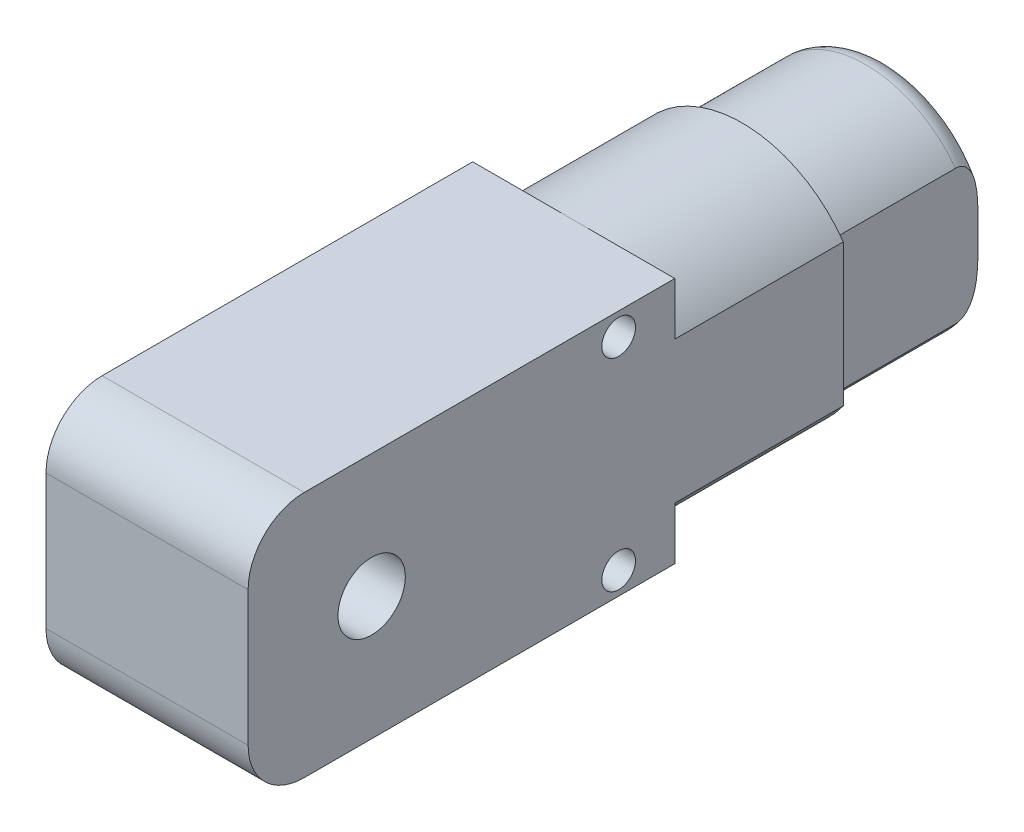
ISO-10303-21;
HEADER;
FILE_DESCRIPTION(('STEP AP214'),'2;1');
FILE_NAME('part.step','',(''),(''),'','','');
FILE_SCHEMA(('AUTOMOTIVE_DESIGN { 1 0 10303 214 1 1 1 1 }'));
ENDSEC;
DATA;
#1=APPLICATION_CONTEXT('core data for automotive mechanical design processes');
#2=APPLICATION_PROTOCOL_DEFINITION('international standard','automotive_design',2000,#1);
#3=PRODUCT_CONTEXT('',#1,'mechanical');
#4=PRODUCT('Part','Part','',(#3));
#5=PRODUCT_RELATED_PRODUCT_CATEGORY('part','',(#4));
#6=PRODUCT_DEFINITION_FORMATION('','',#4);
#7=PRODUCT_DEFINITION_CONTEXT('part definition',#1,'design');
#8=PRODUCT_DEFINITION('design','',#6,#7);
#9=PRODUCT_DEFINITION_SHAPE('','',#8);
#10=(LENGTH_UNIT() NAMED_UNIT(*) SI_UNIT(.MILLI.,.METRE.));
#11=(NAMED_UNIT(*) PLANE_ANGLE_UNIT() SI_UNIT($,.RADIAN.));
#12=(NAMED_UNIT(*) SI_UNIT($,.STERADIAN.) SOLID_ANGLE_UNIT());
#13=UNCERTAINTY_MEASURE_WITH_UNIT(LENGTH_MEASURE(1.E-05),#10,'distance_accuracy_value','');
#14=(GEOMETRIC_REPRESENTATION_CONTEXT(3) GLOBAL_UNCERTAINTY_ASSIGNED_CONTEXT((#13)) GLOBAL_UNIT_ASSIGNED_CONTEXT((#10,
#11,#12)) REPRESENTATION_CONTEXT('',''));
#15=CARTESIAN_POINT('',(0.,0.,0.));
#16=DIRECTION('',(0.,0.,1.));
#17=DIRECTION('',(1.,0.,0.));
#18=AXIS2_PLACEMENT_3D('',#15,#16,#17);
#19=CARTESIAN_POINT('',(18.,0.,0.));
#20=DIRECTION('',(1.,0.,0.));
#21=DIRECTION('',(0.,0.,-1.));
#22=AXIS2_PLACEMENT_3D('',#19,#20,#21);
#23=PLANE('',#22);
#24=CARTESIAN_POINT('',(18.,0.,8.));
#25=DIRECTION('',(1.,0.,0.));
#26=DIRECTION('',(0.,0.,-1.));
#27=AXIS2_PLACEMENT_3D('',#24,#25,#26);
#28=CIRCLE('',#27,3.);
#29=CARTESIAN_POINT('',(18.,0.,5.));
#30=VERTEX_POINT('',#29);
#31=EDGE_CURVE('E618',#30,#30,#28,.T.);
#32=ORIENTED_EDGE('',*,*,#31,.F.);
#33=EDGE_LOOP('',(#32));
#34=FACE_BOUND('',#33,.T.);
#35=DIRECTION('',(0.,0.,1.));
#36=VECTOR('',#35,1.);
#37=CARTESIAN_POINT('',(18.,11.,-19.));
#38=LINE('',#37,#36);
#39=CARTESIAN_POINT('',(18.,11.,-19.));
#40=VERTEX_POINT('',#39);
#41=CARTESIAN_POINT('',(18.,11.,14.));
#42=VERTEX_POINT('',#41);
#43=EDGE_CURVE('E247',#40,#42,#38,.T.);
#44=ORIENTED_EDGE('',*,*,#43,.T.);
#45=CARTESIAN_POINT('',(18.,6.,14.));
#46=DIRECTION('',(1.,0.,0.));
#47=DIRECTION('',(0.,0.,-1.));
#48=AXIS2_PLACEMENT_3D('',#45,#46,#47);
#49=CIRCLE('',#48,5.);
#50=CARTESIAN_POINT('',(18.,6.,19.));
#51=VERTEX_POINT('',#50);
#52=EDGE_CURVE('E294',#42,#51,#49,.T.);
#53=ORIENTED_EDGE('',*,*,#52,.T.);
#54=DIRECTION('',(0.,-1.,0.));
#55=VECTOR('',#54,1.);
#56=CARTESIAN_POINT('',(18.,-11.,19.));
#57=LINE('',#56,#55);
#58=CARTESIAN_POINT('',(18.,-6.,19.));
#59=VERTEX_POINT('',#58);
#60=EDGE_CURVE('E234',#51,#59,#57,.T.);
#61=ORIENTED_EDGE('',*,*,#60,.T.);
#62=CARTESIAN_POINT('',(18.,-6.,14.));
#63=DIRECTION('',(1.,0.,0.));
#64=DIRECTION('',(0.,0.,-1.));
#65=AXIS2_PLACEMENT_3D('',#62,#63,#64);
#66=CIRCLE('',#65,5.);
#67=CARTESIAN_POINT('',(18.,-11.,14.));
#68=VERTEX_POINT('',#67);
#69=EDGE_CURVE('E291',#59,#68,#66,.T.);
#70=ORIENTED_EDGE('',*,*,#69,.T.);
#71=DIRECTION('',(0.,0.,-1.));
#72=VECTOR('',#71,1.);
#73=CARTESIAN_POINT('',(18.,-11.,-19.));
#74=LINE('',#73,#72);
#75=CARTESIAN_POINT('',(18.,-11.,-19.));
#76=VERTEX_POINT('',#75);
#77=EDGE_CURVE('E238',#68,#76,#74,.T.);
#78=ORIENTED_EDGE('',*,*,#77,.T.);
#79=DIRECTION('',(0.,1.,0.));
#80=VECTOR('',#79,1.);
#81=CARTESIAN_POINT('',(18.,-11.,-19.));
#82=LINE('',#81,#80);
#83=CARTESIAN_POINT('',(18.,-6.32455532033677,-19.));
#84=VERTEX_POINT('',#83);
#85=EDGE_CURVE('E243',#76,#84,#82,.T.);
#86=ORIENTED_EDGE('',*,*,#85,.T.);
#87=DIRECTION('',(0.,0.,1.));
#88=VECTOR('',#87,1.);
#89=CARTESIAN_POINT('',(18.,-6.32455532033677,-34.));
#90=LINE('',#89,#88);
#91=CARTESIAN_POINT('',(18.,-6.32455532033677,-34.));
#92=VERTEX_POINT('',#91);
#93=EDGE_CURVE('E209',#92,#84,#90,.T.);
#94=ORIENTED_EDGE('',*,*,#93,.F.);
#95=DIRECTION('',(0.,-1.,0.));
#96=VECTOR('',#95,1.);
#97=CARTESIAN_POINT('',(18.,6.32455532033677,-34.));
#98=LINE('',#97,#96);
#99=CARTESIAN_POINT('',(18.,6.32455532033677,-34.));
#100=VERTEX_POINT('',#99);
#101=EDGE_CURVE('E206',#100,#92,#98,.T.);
#102=ORIENTED_EDGE('',*,*,#101,.F.);
#103=DIRECTION('',(0.,0.,1.));
#104=VECTOR('',#103,1.);
#105=CARTESIAN_POINT('',(18.,6.32455532033677,-34.));
#106=LINE('',#105,#104);
#107=CARTESIAN_POINT('',(18.,6.32455532033677,-19.));
#108=VERTEX_POINT('',#107);
#109=EDGE_CURVE('E221',#100,#108,#106,.T.);
#110=ORIENTED_EDGE('',*,*,#109,.T.);
#111=EDGE_CURVE('E242',#108,#40,#82,.T.);
#112=ORIENTED_EDGE('',*,*,#111,.T.);
#113=EDGE_LOOP('',(#44,#53,#61,#70,#78,#86,#94,#102,#110,#112));
#114=FACE_BOUND('',#113,.T.);
#115=CARTESIAN_POINT('',(18.,-9.,-14.));
#116=DIRECTION('',(1.,0.,0.));
#117=DIRECTION('',(0.,0.,-1.));
#118=AXIS2_PLACEMENT_3D('',#115,#116,#117);
#119=CIRCLE('',#118,1.5);
#120=CARTESIAN_POINT('',(18.,-9.,-15.5));
#121=VERTEX_POINT('',#120);
#122=EDGE_CURVE('E632',#121,#121,#119,.T.);
#123=ORIENTED_EDGE('',*,*,#122,.F.);
#124=EDGE_LOOP('',(#123));
#125=FACE_BOUND('',#124,.T.);
#126=CARTESIAN_POINT('',(18.,9.,-14.));
#127=DIRECTION('',(-1.,0.,0.));
#128=DIRECTION('',(0.,0.,1.));
#129=AXIS2_PLACEMENT_3D('',#126,#127,#128);
#130=CIRCLE('',#129,1.5);
#131=CARTESIAN_POINT('',(18.,9.,-12.5));
#132=VERTEX_POINT('',#131);
#133=EDGE_CURVE('E620',#132,#132,#130,.T.);
#134=ORIENTED_EDGE('',*,*,#133,.T.);
#135=EDGE_LOOP('',(#134));
#136=FACE_BOUND('',#135,.T.);
#137=ADVANCED_FACE('F41',(#34,#114,#125,#136),#23,.T.);
#138=CARTESIAN_POINT('',(0.,0.,0.));
#139=DIRECTION('',(1.,0.,0.));
#140=DIRECTION('',(0.,0.,-1.));
#141=AXIS2_PLACEMENT_3D('',#138,#139,#140);
#142=PLANE('',#141);
#143=CARTESIAN_POINT('',(0.,0.,8.));
#144=DIRECTION('',(1.,0.,0.));
#145=DIRECTION('',(0.,0.,-1.));
#146=AXIS2_PLACEMENT_3D('',#143,#144,#145);
#147=CIRCLE('',#146,3.);
#148=CARTESIAN_POINT('',(0.,0.,5.));
#149=VERTEX_POINT('',#148);
#150=EDGE_CURVE('E181',#149,#149,#147,.T.);
#151=ORIENTED_EDGE('',*,*,#150,.T.);
#152=EDGE_LOOP('',(#151));
#153=FACE_BOUND('',#152,.T.);
#154=CARTESIAN_POINT('',(0.,-9.,-14.));
#155=DIRECTION('',(1.,0.,0.));
#156=DIRECTION('',(0.,0.,-1.));
#157=AXIS2_PLACEMENT_3D('',#154,#155,#156);
#158=CIRCLE('',#157,1.5);
#159=CARTESIAN_POINT('',(0.,-9.,-15.5));
#160=VERTEX_POINT('',#159);
#161=EDGE_CURVE('E635',#160,#160,#158,.T.);
#162=ORIENTED_EDGE('',*,*,#161,.T.);
#163=EDGE_LOOP('',(#162));
#164=FACE_BOUND('',#163,.T.);
#165=DIRECTION('',(0.,-1.,0.));
#166=VECTOR('',#165,1.);
#167=CARTESIAN_POINT('',(0.,-11.,19.));
#168=LINE('',#167,#166);
#169=CARTESIAN_POINT('',(0.,6.,19.));
#170=VERTEX_POINT('',#169);
#171=CARTESIAN_POINT('',(0.,-6.,19.));
#172=VERTEX_POINT('',#171);
#173=EDGE_CURVE('E233',#170,#172,#168,.T.);
#174=ORIENTED_EDGE('',*,*,#173,.F.);
#175=CARTESIAN_POINT('',(0.,6.,14.));
#176=DIRECTION('',(1.,0.,0.));
#177=DIRECTION('',(0.,0.,-1.));
#178=AXIS2_PLACEMENT_3D('',#175,#176,#177);
#179=CIRCLE('',#178,5.);
#180=CARTESIAN_POINT('',(0.,11.,14.));
#181=VERTEX_POINT('',#180);
#182=EDGE_CURVE('E285',#170,#181,#179,.F.);
#183=ORIENTED_EDGE('',*,*,#182,.T.);
#184=DIRECTION('',(0.,0.,1.));
#185=VECTOR('',#184,1.);
#186=CARTESIAN_POINT('',(0.,11.,-19.));
#187=LINE('',#186,#185);
#188=CARTESIAN_POINT('',(0.,11.,-19.));
#189=VERTEX_POINT('',#188);
#190=EDGE_CURVE('E239',#189,#181,#187,.T.);
#191=ORIENTED_EDGE('',*,*,#190,.F.);
#192=DIRECTION('',(0.,1.,0.));
#193=VECTOR('',#192,1.);
#194=CARTESIAN_POINT('',(0.,-11.,-19.));
#195=LINE('',#194,#193);
#196=CARTESIAN_POINT('',(0.,6.32455532033677,-19.));
#197=VERTEX_POINT('',#196);
#198=EDGE_CURVE('E259',#197,#189,#195,.T.);
#199=ORIENTED_EDGE('',*,*,#198,.F.);
#200=DIRECTION('',(0.,0.,1.));
#201=VECTOR('',#200,1.);
#202=CARTESIAN_POINT('',(0.,6.32455532033677,-34.));
#203=LINE('',#202,#201);
#204=CARTESIAN_POINT('',(0.,6.32455532033677,-34.));
#205=VERTEX_POINT('',#204);
#206=EDGE_CURVE('E225',#205,#197,#203,.T.);
#207=ORIENTED_EDGE('',*,*,#206,.F.);
#208=DIRECTION('',(0.,1.,0.));
#209=VECTOR('',#208,1.);
#210=CARTESIAN_POINT('',(0.,-6.32455532033677,-34.));
#211=LINE('',#210,#209);
#212=CARTESIAN_POINT('',(0.,-6.32455532033677,-34.));
#213=VERTEX_POINT('',#212);
#214=EDGE_CURVE('E199',#213,#205,#211,.T.);
#215=ORIENTED_EDGE('',*,*,#214,.F.);
#216=DIRECTION('',(0.,0.,1.));
#217=VECTOR('',#216,1.);
#218=CARTESIAN_POINT('',(0.,-6.32455532033677,-34.));
#219=LINE('',#218,#217);
#220=CARTESIAN_POINT('',(0.,-6.32455532033677,-19.));
#221=VERTEX_POINT('',#220);
#222=EDGE_CURVE('E229',#213,#221,#219,.T.);
#223=ORIENTED_EDGE('',*,*,#222,.T.);
#224=CARTESIAN_POINT('',(0.,-11.,-19.));
#225=VERTEX_POINT('',#224);
#226=EDGE_CURVE('E260',#225,#221,#195,.T.);
#227=ORIENTED_EDGE('',*,*,#226,.F.);
#228=DIRECTION('',(0.,0.,-1.));
#229=VECTOR('',#228,1.);
#230=CARTESIAN_POINT('',(0.,-11.,-19.));
#231=LINE('',#230,#229);
#232=CARTESIAN_POINT('',(0.,-11.,14.));
#233=VERTEX_POINT('',#232);
#234=EDGE_CURVE('E255',#233,#225,#231,.T.);
#235=ORIENTED_EDGE('',*,*,#234,.F.);
#236=CARTESIAN_POINT('',(0.,-6.,14.));
#237=DIRECTION('',(1.,0.,0.));
#238=DIRECTION('',(0.,0.,-1.));
#239=AXIS2_PLACEMENT_3D('',#236,#237,#238);
#240=CIRCLE('',#239,5.);
#241=EDGE_CURVE('E282',#233,#172,#240,.F.);
#242=ORIENTED_EDGE('',*,*,#241,.T.);
#243=EDGE_LOOP('',(#174,#183,#191,#199,#207,#215,#223,#227,#235,#242));
#244=FACE_BOUND('',#243,.T.);
#245=CARTESIAN_POINT('',(0.,9.,-14.));
#246=DIRECTION('',(-1.,0.,0.));
#247=DIRECTION('',(0.,0.,1.));
#248=AXIS2_PLACEMENT_3D('',#245,#246,#247);
#249=CIRCLE('',#248,1.5);
#250=CARTESIAN_POINT('',(0.,9.,-12.5));
#251=VERTEX_POINT('',#250);
#252=EDGE_CURVE('E626',#251,#251,#249,.T.);
#253=ORIENTED_EDGE('',*,*,#252,.F.);
#254=EDGE_LOOP('',(#253));
#255=FACE_BOUND('',#254,.T.);
#256=ADVANCED_FACE('F384',(#153,#164,#244,#255),#142,.F.);
#257=CARTESIAN_POINT('',(18.,-11.,-19.));
#258=DIRECTION('',(0.,0.,1.));
#259=DIRECTION('',(1.,0.,0.));
#260=AXIS2_PLACEMENT_3D('',#257,#258,#259);
#261=PLANE('',#260);
#262=CARTESIAN_POINT('',(9.,0.,-19.));
#263=DIRECTION('',(0.,0.,-1.));
#264=DIRECTION('',(-1.,0.,0.));
#265=AXIS2_PLACEMENT_3D('',#262,#263,#264);
#266=CIRCLE('',#265,11.);
#267=CARTESIAN_POINT('',(9.,-11.,-19.));
#268=VERTEX_POINT('',#267);
#269=EDGE_CURVE('E194',#84,#268,#266,.T.);
#270=ORIENTED_EDGE('',*,*,#269,.F.);
#271=ORIENTED_EDGE('',*,*,#85,.F.);
#272=DIRECTION('',(-1.,0.,0.));
#273=VECTOR('',#272,1.);
#274=CARTESIAN_POINT('',(18.,-11.,-19.));
#275=LINE('',#274,#273);
#276=EDGE_CURVE('E271',#76,#268,#275,.T.);
#277=ORIENTED_EDGE('',*,*,#276,.T.);
#278=EDGE_LOOP('',(#270,#271,#277));
#279=FACE_BOUND('',#278,.T.);
#280=ADVANCED_FACE('F380',(#279),#261,.F.);
#281=EDGE_CURVE('E213',#268,#221,#266,.T.);
#282=ORIENTED_EDGE('',*,*,#281,.F.);
#283=EDGE_CURVE('E270',#268,#225,#275,.T.);
#284=ORIENTED_EDGE('',*,*,#283,.T.);
#285=ORIENTED_EDGE('',*,*,#226,.T.);
#286=EDGE_LOOP('',(#282,#284,#285));
#287=FACE_BOUND('',#286,.T.);
#288=ADVANCED_FACE('F456',(#287),#261,.F.);
#289=CARTESIAN_POINT('',(9.,0.,-19.));
#290=DIRECTION('',(0.,0.,-1.));
#291=DIRECTION('',(-1.,0.,0.));
#292=AXIS2_PLACEMENT_3D('',#289,#290,#291);
#293=CIRCLE('',#292,11.);
#294=CARTESIAN_POINT('',(9.,11.,-19.));
#295=VERTEX_POINT('',#294);
#296=EDGE_CURVE('E200',#197,#295,#293,.T.);
#297=ORIENTED_EDGE('',*,*,#296,.F.);
#298=ORIENTED_EDGE('',*,*,#198,.T.);
#299=DIRECTION('',(-1.,0.,0.));
#300=VECTOR('',#299,1.);
#301=CARTESIAN_POINT('',(18.,11.,-19.));
#302=LINE('',#301,#300);
#303=EDGE_CURVE('E251',#295,#189,#302,.T.);
#304=ORIENTED_EDGE('',*,*,#303,.F.);
#305=EDGE_LOOP('',(#297,#298,#304));
#306=FACE_BOUND('',#305,.T.);
#307=ADVANCED_FACE('F371',(#306),#261,.F.);
#308=CARTESIAN_POINT('',(18.,-11.,19.));
#309=DIRECTION('',(0.,0.,-1.));
#310=DIRECTION('',(-1.,0.,0.));
#311=AXIS2_PLACEMENT_3D('',#308,#309,#310);
#312=PLANE('',#311);
#313=ORIENTED_EDGE('',*,*,#60,.F.);
#314=DIRECTION('',(-1.,0.,0.));
#315=VECTOR('',#314,1.);
#316=CARTESIAN_POINT('',(18.,6.,19.));
#317=LINE('',#316,#315);
#318=EDGE_CURVE('E278',#51,#170,#317,.T.);
#319=ORIENTED_EDGE('',*,*,#318,.T.);
#320=ORIENTED_EDGE('',*,*,#173,.T.);
#321=DIRECTION('',(-1.,0.,0.));
#322=VECTOR('',#321,1.);
#323=CARTESIAN_POINT('',(18.,-6.,19.));
#324=LINE('',#323,#322);
#325=EDGE_CURVE('E275',#172,#59,#324,.F.);
#326=ORIENTED_EDGE('',*,*,#325,.T.);
#327=EDGE_LOOP('',(#313,#319,#320,#326));
#328=FACE_BOUND('',#327,.T.);
#329=ADVANCED_FACE('F367',(#328),#312,.F.);
#330=CARTESIAN_POINT('',(18.,-11.,-19.));
#331=DIRECTION('',(0.,1.,0.));
#332=DIRECTION('',(0.,0.,1.));
#333=AXIS2_PLACEMENT_3D('',#330,#331,#332);
#334=PLANE('',#333);
#335=ORIENTED_EDGE('',*,*,#77,.F.);
#336=DIRECTION('',(-1.,0.,0.));
#337=VECTOR('',#336,1.);
#338=CARTESIAN_POINT('',(18.,-11.,14.));
#339=LINE('',#338,#337);
#340=EDGE_CURVE('E297',#68,#233,#339,.T.);
#341=ORIENTED_EDGE('',*,*,#340,.T.);
#342=ORIENTED_EDGE('',*,*,#234,.T.);
#343=ORIENTED_EDGE('',*,*,#283,.F.);
#344=ORIENTED_EDGE('',*,*,#276,.F.);
#345=EDGE_LOOP('',(#335,#341,#342,#343,#344));
#346=FACE_BOUND('',#345,.T.);
#347=ADVANCED_FACE('F370',(#346),#334,.F.);
#348=EDGE_CURVE('E217',#295,#108,#293,.T.);
#349=ORIENTED_EDGE('',*,*,#348,.F.);
#350=EDGE_CURVE('E266',#40,#295,#302,.T.);
#351=ORIENTED_EDGE('',*,*,#350,.F.);
#352=ORIENTED_EDGE('',*,*,#111,.F.);
#353=EDGE_LOOP('',(#349,#351,#352));
#354=FACE_BOUND('',#353,.T.);
#355=ADVANCED_FACE('F375',(#354),#261,.F.);
#356=CARTESIAN_POINT('',(18.,11.,-19.));
#357=DIRECTION('',(0.,-1.,0.));
#358=DIRECTION('',(0.,0.,-1.));
#359=AXIS2_PLACEMENT_3D('',#356,#357,#358);
#360=PLANE('',#359);
#361=ORIENTED_EDGE('',*,*,#190,.T.);
#362=DIRECTION('',(-1.,0.,0.));
#363=VECTOR('',#362,1.);
#364=CARTESIAN_POINT('',(18.,11.,14.));
#365=LINE('',#364,#363);
#366=EDGE_CURVE('E288',#181,#42,#365,.F.);
#367=ORIENTED_EDGE('',*,*,#366,.T.);
#368=ORIENTED_EDGE('',*,*,#43,.F.);
#369=ORIENTED_EDGE('',*,*,#350,.T.);
#370=ORIENTED_EDGE('',*,*,#303,.T.);
#371=EDGE_LOOP('',(#361,#367,#368,#369,#370));
#372=FACE_BOUND('',#371,.T.);
#373=ADVANCED_FACE('F365',(#372),#360,.F.);
#374=CARTESIAN_POINT('',(18.,6.,14.));
#375=DIRECTION('',(-1.,0.,0.));
#376=DIRECTION('',(0.,0.,1.));
#377=AXIS2_PLACEMENT_3D('',#374,#375,#376);
#378=CYLINDRICAL_SURFACE('',#377,5.);
#379=ORIENTED_EDGE('',*,*,#52,.F.);
#380=ORIENTED_EDGE('',*,*,#366,.F.);
#381=ORIENTED_EDGE('',*,*,#182,.F.);
#382=ORIENTED_EDGE('',*,*,#318,.F.);
#383=EDGE_LOOP('',(#379,#380,#381,#382));
#384=FACE_BOUND('',#383,.T.);
#385=ADVANCED_FACE('F361',(#384),#378,.T.);
#386=CARTESIAN_POINT('',(18.,-6.,14.));
#387=DIRECTION('',(-1.,0.,0.));
#388=DIRECTION('',(0.,0.,1.));
#389=AXIS2_PLACEMENT_3D('',#386,#387,#388);
#390=CYLINDRICAL_SURFACE('',#389,5.);
#391=ORIENTED_EDGE('',*,*,#69,.F.);
#392=ORIENTED_EDGE('',*,*,#325,.F.);
#393=ORIENTED_EDGE('',*,*,#241,.F.);
#394=ORIENTED_EDGE('',*,*,#340,.F.);
#395=EDGE_LOOP('',(#391,#392,#393,#394));
#396=FACE_BOUND('',#395,.T.);
#397=ADVANCED_FACE('F356',(#396),#390,.T.);
#398=CARTESIAN_POINT('',(9.,0.,-34.));
#399=DIRECTION('',(0.,0.,1.));
#400=DIRECTION('',(1.,0.,0.));
#401=AXIS2_PLACEMENT_3D('',#398,#399,#400);
#402=CYLINDRICAL_SURFACE('',#401,11.);
#403=ORIENTED_EDGE('',*,*,#269,.T.);
#404=ORIENTED_EDGE('',*,*,#281,.T.);
#405=ORIENTED_EDGE('',*,*,#222,.F.);
#406=CARTESIAN_POINT('',(9.,0.,-34.));
#407=DIRECTION('',(0.,0.,-1.));
#408=DIRECTION('',(-1.,0.,0.));
#409=AXIS2_PLACEMENT_3D('',#406,#407,#408);
#410=CIRCLE('',#409,11.);
#411=EDGE_CURVE('E195',#92,#213,#410,.T.);
#412=ORIENTED_EDGE('',*,*,#411,.F.);
#413=ORIENTED_EDGE('',*,*,#93,.T.);
#414=EDGE_LOOP('',(#403,#404,#405,#412,#413));
#415=FACE_BOUND('',#414,.T.);
#416=ADVANCED_FACE('F360',(#415),#402,.T.);
#417=CARTESIAN_POINT('',(9.,0.,-34.));
#418=DIRECTION('',(0.,0.,1.));
#419=DIRECTION('',(1.,0.,0.));
#420=AXIS2_PLACEMENT_3D('',#417,#418,#419);
#421=CYLINDRICAL_SURFACE('',#420,11.);
#422=ORIENTED_EDGE('',*,*,#296,.T.);
#423=ORIENTED_EDGE('',*,*,#348,.T.);
#424=ORIENTED_EDGE('',*,*,#109,.F.);
#425=CARTESIAN_POINT('',(9.,0.,-34.));
#426=DIRECTION('',(0.,0.,-1.));
#427=DIRECTION('',(-1.,0.,0.));
#428=AXIS2_PLACEMENT_3D('',#425,#426,#427);
#429=CIRCLE('',#428,11.);
#430=EDGE_CURVE('E203',#205,#100,#429,.T.);
#431=ORIENTED_EDGE('',*,*,#430,.F.);
#432=ORIENTED_EDGE('',*,*,#206,.T.);
#433=EDGE_LOOP('',(#422,#423,#424,#431,#432));
#434=FACE_BOUND('',#433,.T.);
#435=ADVANCED_FACE('F393',(#434),#421,.T.);
#436=CARTESIAN_POINT('',(9.,0.,-34.));
#437=DIRECTION('',(0.,0.,-1.));
#438=DIRECTION('',(-1.,0.,0.));
#439=AXIS2_PLACEMENT_3D('',#436,#437,#438);
#440=PLANE('',#439);
#441=CARTESIAN_POINT('',(9.,0.,-34.));
#442=DIRECTION('',(0.,0.,-1.));
#443=DIRECTION('',(-1.,0.,0.));
#444=AXIS2_PLACEMENT_3D('',#441,#442,#443);
#445=CIRCLE('',#444,10.);
#446=CARTESIAN_POINT('',(17.,-6.00000000000001,-34.));
#447=VERTEX_POINT('',#446);
#448=CARTESIAN_POINT('',(1.,-6.,-34.));
#449=VERTEX_POINT('',#448);
#450=EDGE_CURVE('E178',#447,#449,#445,.T.);
#451=ORIENTED_EDGE('',*,*,#450,.F.);
#452=DIRECTION('',(0.,-1.,0.));
#453=VECTOR('',#452,1.);
#454=CARTESIAN_POINT('',(17.,6.,-34.));
#455=LINE('',#454,#453);
#456=CARTESIAN_POINT('',(17.,6.,-34.));
#457=VERTEX_POINT('',#456);
#458=EDGE_CURVE('E173',#457,#447,#455,.T.);
#459=ORIENTED_EDGE('',*,*,#458,.F.);
#460=CARTESIAN_POINT('',(9.,0.,-34.));
#461=DIRECTION('',(0.,0.,-1.));
#462=DIRECTION('',(-1.,0.,0.));
#463=AXIS2_PLACEMENT_3D('',#460,#461,#462);
#464=CIRCLE('',#463,10.);
#465=CARTESIAN_POINT('',(1.,6.,-34.));
#466=VERTEX_POINT('',#465);
#467=EDGE_CURVE('E157',#466,#457,#464,.T.);
#468=ORIENTED_EDGE('',*,*,#467,.F.);
#469=DIRECTION('',(0.,1.,0.));
#470=VECTOR('',#469,1.);
#471=CARTESIAN_POINT('',(1.,-6.,-34.));
#472=LINE('',#471,#470);
#473=EDGE_CURVE('E170',#449,#466,#472,.T.);
#474=ORIENTED_EDGE('',*,*,#473,.F.);
#475=EDGE_LOOP('',(#451,#459,#468,#474));
#476=FACE_BOUND('',#475,.T.);
#477=ORIENTED_EDGE('',*,*,#411,.T.);
#478=ORIENTED_EDGE('',*,*,#214,.T.);
#479=ORIENTED_EDGE('',*,*,#430,.T.);
#480=ORIENTED_EDGE('',*,*,#101,.T.);
#481=EDGE_LOOP('',(#477,#478,#479,#480));
#482=FACE_BOUND('',#481,.T.);
#483=ADVANCED_FACE('F168',(#476,#482),#440,.T.);
#484=CARTESIAN_POINT('',(9.,0.,-47.));
#485=DIRECTION('',(0.,0.,1.));
#486=DIRECTION('',(1.,0.,0.));
#487=AXIS2_PLACEMENT_3D('',#484,#485,#486);
#488=CYLINDRICAL_SURFACE('',#487,10.);
#489=DIRECTION('',(0.,0.,1.));
#490=VECTOR('',#489,1.);
#491=CARTESIAN_POINT('',(1.,-6.,-47.));
#492=LINE('',#491,#490);
#493=CARTESIAN_POINT('',(1.,-6.,-45.));
#494=VERTEX_POINT('',#493);
#495=EDGE_CURVE('E161',#494,#449,#492,.T.);
#496=ORIENTED_EDGE('',*,*,#495,.F.);
#497=CARTESIAN_POINT('',(9.,0.,-45.));
#498=DIRECTION('',(0.,0.,-1.));
#499=DIRECTION('',(-1.,0.,0.));
#500=AXIS2_PLACEMENT_3D('',#497,#498,#499);
#501=CIRCLE('',#500,10.);
#502=CARTESIAN_POINT('',(17.,-6.00000000000001,-45.));
#503=VERTEX_POINT('',#502);
#504=EDGE_CURVE('E11',#494,#503,#501,.F.);
#505=ORIENTED_EDGE('',*,*,#504,.T.);
#506=DIRECTION('',(0.,0.,1.));
#507=VECTOR('',#506,1.);
#508=CARTESIAN_POINT('',(17.,-6.00000000000001,-47.));
#509=LINE('',#508,#507);
#510=EDGE_CURVE('E187',#503,#447,#509,.T.);
#511=ORIENTED_EDGE('',*,*,#510,.T.);
#512=ORIENTED_EDGE('',*,*,#450,.T.);
#513=EDGE_LOOP('',(#496,#505,#511,#512));
#514=FACE_BOUND('',#513,.T.);
#515=ADVANCED_FACE('F338',(#514),#488,.T.);
#516=CARTESIAN_POINT('',(1.,-6.,-47.));
#517=DIRECTION('',(1.,0.,0.));
#518=DIRECTION('',(0.,1.,0.));
#519=AXIS2_PLACEMENT_3D('',#516,#517,#518);
#520=PLANE('',#519);
#521=DIRECTION('',(0.,0.,1.));
#522=VECTOR('',#521,1.);
#523=CARTESIAN_POINT('',(1.,6.,-47.));
#524=LINE('',#523,#522);
#525=CARTESIAN_POINT('',(1.,6.,-45.));
#526=VERTEX_POINT('',#525);
#527=EDGE_CURVE('E154',#526,#466,#524,.T.);
#528=ORIENTED_EDGE('',*,*,#527,.F.);
#529=CARTESIAN_POINT('',(1.,6.,-45.));
#530=CARTESIAN_POINT('',(1.,6.00001655769487,-45.0399669878583));
#531=CARTESIAN_POINT('',(1.,5.99800391380619,-45.0799246813933));
#532=CARTESIAN_POINT('',(1.,5.99004808304321,-45.1594094026167));
#533=CARTESIAN_POINT('',(1.,5.98410868058739,-45.1989368077506));
#534=CARTESIAN_POINT('',(1.,5.96850487786722,-45.2768371617478));
#535=CARTESIAN_POINT('',(1.,5.95887818631883,-45.3152176895836));
#536=CARTESIAN_POINT('',(1.,5.93612345891434,-45.3909196090833));
#537=CARTESIAN_POINT('',(1.,5.92299481087911,-45.4282408143032));
#538=CARTESIAN_POINT('',(1.,5.87885270689584,-45.5379366070725));
#539=CARTESIAN_POINT('',(1.,5.84300569501363,-45.6084115156065));
#540=CARTESIAN_POINT('',(1.,5.76075900506967,-45.7429856248413));
#541=CARTESIAN_POINT('',(1.,5.71433109344969,-45.8070670956183));
#542=CARTESIAN_POINT('',(1.,5.59043800178741,-45.9557253905237));
#543=CARTESIAN_POINT('',(1.,5.50842155721041,-46.0365008614413));
#544=CARTESIAN_POINT('',(1.,5.33285514795295,-46.1840870220799));
#545=CARTESIAN_POINT('',(1.,5.23929276195724,-46.2508824599445));
#546=CARTESIAN_POINT('',(1.,5.06272053778967,-46.3607959540781));
#547=CARTESIAN_POINT('',(1.,4.98098515093701,-46.4060071318899));
#548=CARTESIAN_POINT('',(1.,4.81386636202088,-46.4891918163905));
#549=CARTESIAN_POINT('',(1.,4.728480245972,-46.5271598197545));
#550=CARTESIAN_POINT('',(1.,4.55435646183617,-46.5970463736951));
#551=CARTESIAN_POINT('',(1.,4.46559467978503,-46.6289041048805));
#552=CARTESIAN_POINT('',(1.,4.28633048526529,-46.6869436879047));
#553=CARTESIAN_POINT('',(1.,4.19582938715179,-46.7131296553024));
#554=CARTESIAN_POINT('',(1.,3.93197184508646,-46.7819062358157));
#555=CARTESIAN_POINT('',(1.,3.75697386538453,-46.818195555904));
#556=CARTESIAN_POINT('',(1.,3.40472756063543,-46.8777554854841));
#557=CARTESIAN_POINT('',(1.,3.22747693457677,-46.9010114674966));
#558=CARTESIAN_POINT('',(1.,2.87099651532427,-46.9381613982574));
#559=CARTESIAN_POINT('',(1.,2.69176120893464,-46.9519998900262));
#560=CARTESIAN_POINT('',(1.,2.33289688630192,-46.9731044073819));
#561=CARTESIAN_POINT('',(1.,2.15326778437773,-46.9803688222971));
#562=CARTESIAN_POINT('',(1.,1.80810904166086,-46.9903533523689));
#563=CARTESIAN_POINT('',(1.,1.64258728509504,-46.9933872907493));
#564=CARTESIAN_POINT('',(1.,1.31150948514901,-46.9974611174878));
#565=CARTESIAN_POINT('',(1.,1.14595344003265,-46.9985008300741));
#566=CARTESIAN_POINT('',(1.,0.816983618760505,-46.9996999597636));
#567=CARTESIAN_POINT('',(1.,0.653569862496142,-46.9998706015798));
#568=CARTESIAN_POINT('',(1.,0.408463812685022,-46.9999802968431));
#569=CARTESIAN_POINT('',(1.,0.326771507202567,-46.9999924894498));
#570=CARTESIAN_POINT('',(1.,0.163386136433459,-47.0000004676709));
#571=CARTESIAN_POINT('',(1.,0.0816930711467887,-46.999996253133));
#572=CARTESIAN_POINT('',(1.,0.,-47.));
#573=B_SPLINE_CURVE_WITH_KNOTS('',3,(#529,#530,#531,#532,#533,#534,#535,#536,#537,#538,#539,
#540,#541,#542,#543,#544,#545,#546,#547,#548,#549,#550,#551,#552,#553,#554,#555,#556,#557,#558,
#559,#560,#561,#562,#563,#564,#565,#566,#567,#568,#569,#570,#571,#572),.UNSPECIFIED.,.F.,.F.,(4,
2,2,2,2,2,2,2,2,2,2,2,2,2,2,2,2,2,2,2,2,4),(0.,0.119835269762745,0.239555216160278,
0.358082174384511,0.476629865971994,0.712613020384899,0.949233390463091,1.29263625480677,
1.6364118321544,1.91624032008161,2.19628058070984,2.47897803797934,2.76146967126792,
3.29686395695709,3.83285792520368,4.37198151658659,4.91123715939832,5.4078660810193,
5.90453877366221,6.39477999204487,6.63985691908584,6.88493611988961),.UNSPECIFIED.);
#574=CARTESIAN_POINT('',(1.,0.,-47.));
#575=VERTEX_POINT('',#574);
#576=EDGE_CURVE('E51',#526,#575,#573,.T.);
#577=ORIENTED_EDGE('',*,*,#576,.T.);
#578=CARTESIAN_POINT('',(1.,0.,-47.));
#579=CARTESIAN_POINT('',(1.,-0.0815256911301688,-46.9999962888067));
#580=CARTESIAN_POINT('',(1.,-0.163051372357929,-47.0000004664107));
#581=CARTESIAN_POINT('',(1.,-0.326102093018272,-46.9999925482352));
#582=CARTESIAN_POINT('',(1.,-0.407627132450869,-46.9999804525835));
#583=CARTESIAN_POINT('',(1.,-0.652229892349989,-46.9998716682262));
#584=CARTESIAN_POINT('',(1.,-0.815307636964552,-46.999702461658));
#585=CARTESIAN_POINT('',(1.,-1.14329296166651,-46.9985141166798));
#586=CARTESIAN_POINT('',(1.,-1.30820052386534,-46.9974854545357));
#587=CARTESIAN_POINT('',(1.,-1.63798332018526,-46.9934599199489));
#588=CARTESIAN_POINT('',(1.,-1.80285855584347,-46.9904632071147));
#589=CARTESIAN_POINT('',(1.,-2.13874869322996,-46.9808309714105));
#590=CARTESIAN_POINT('',(1.,-2.30976022914517,-46.9740622562945));
#591=CARTESIAN_POINT('',(1.,-2.6514475399846,-46.9547047898215));
#592=CARTESIAN_POINT('',(1.,-2.82212337736691,-46.942117249731));
#593=CARTESIAN_POINT('',(1.,-3.16187253475317,-46.9086517534402));
#594=CARTESIAN_POINT('',(1.,-3.33094961541483,-46.8878136223276));
#595=CARTESIAN_POINT('',(1.,-3.66728680223031,-46.8348257178457));
#596=CARTESIAN_POINT('',(1.,-3.8345484337323,-46.8026863450016));
#597=CARTESIAN_POINT('',(1.,-4.06533605858653,-46.7473998704261));
#598=CARTESIAN_POINT('',(1.,-4.13038985133131,-46.7305793868255));
#599=CARTESIAN_POINT('',(1.,-4.25979624643085,-46.6943211547971));
#600=CARTESIAN_POINT('',(1.,-4.32414857441017,-46.6748824193412));
#601=CARTESIAN_POINT('',(1.,-4.45181184045551,-46.6331455329783));
#602=CARTESIAN_POINT('',(1.,-4.5151243004276,-46.6108520784693));
#603=CARTESIAN_POINT('',(1.,-4.6405245731469,-46.5630815568891));
#604=CARTESIAN_POINT('',(1.,-4.70261249818493,-46.5376047833171));
#605=CARTESIAN_POINT('',(1.,-4.88772326871491,-46.4554040542134));
#606=CARTESIAN_POINT('',(1.,-5.00843325479367,-46.3932731008203));
#607=CARTESIAN_POINT('',(1.,-5.23949465328171,-46.2518805423909));
#608=CARTESIAN_POINT('',(1.,-5.34986229885835,-46.1726464506585));
#609=CARTESIAN_POINT('',(1.,-5.51853766290954,-46.025292299916));
#610=CARTESIAN_POINT('',(1.,-5.58168506734878,-45.9627406293619));
#611=CARTESIAN_POINT('',(1.,-5.69803112003677,-45.8289042785187));
#612=CARTESIAN_POINT('',(1.,-5.75123904210778,-45.7576278425315));
#613=CARTESIAN_POINT('',(1.,-5.83743000789865,-45.6182538768393));
#614=CARTESIAN_POINT('',(1.,-5.87225398977107,-45.5513022809229));
#615=CARTESIAN_POINT('',(1.,-5.93025250016279,-45.4125721178423));
#616=CARTESIAN_POINT('',(1.,-5.95345126451051,-45.3408039495171));
#617=CARTESIAN_POINT('',(1.,-5.97988384790095,-45.2237348082305));
#618=CARTESIAN_POINT('',(1.,-5.98739356822226,-45.1793687592777));
#619=CARTESIAN_POINT('',(1.,-5.99746505130332,-45.0900135622194));
#620=CARTESIAN_POINT('',(1.,-6.00001939827703,-45.0450235815617));
#621=CARTESIAN_POINT('',(1.,-6.,-45.));
#622=B_SPLINE_CURVE_WITH_KNOTS('',3,(#578,#579,#580,#581,#582,#583,#584,#585,#586,#587,#588,
#589,#590,#591,#592,#593,#594,#595,#596,#597,#598,#599,#600,#601,#602,#603,#604,#605,#606,#607,
#608,#609,#610,#611,#612,#613,#614,#615,#616,#617,#618,#619,#620,#621),.UNSPECIFIED.,.F.,.F.,(4,
2,2,2,2,2,2,2,2,2,2,2,2,2,2,2,2,2,2,2,2,4),(0.,0.244577052682379,0.489152185548621,
0.978385303670443,1.47311270552023,1.96779999004288,2.48117587827599,2.99444494851546,
3.5052661280823,4.01561842436179,4.21715418664967,4.41876613759979,4.62005057139869,
4.82131646062229,5.22747533336842,5.63298563616462,5.89885687168081,6.1644787889776,
6.38998058364061,6.61501028397752,6.74974610199218,6.88468339898542),.UNSPECIFIED.);
#623=EDGE_CURVE('E58',#575,#494,#622,.T.);
#624=ORIENTED_EDGE('',*,*,#623,.T.);
#625=ORIENTED_EDGE('',*,*,#495,.T.);
#626=ORIENTED_EDGE('',*,*,#473,.T.);
#627=EDGE_LOOP('',(#528,#577,#624,#625,#626));
#628=FACE_BOUND('',#627,.T.);
#629=ADVANCED_FACE('F176',(#628),#520,.F.);
#630=CARTESIAN_POINT('',(9.,0.,-47.));
#631=DIRECTION('',(0.,0.,1.));
#632=DIRECTION('',(1.,0.,0.));
#633=AXIS2_PLACEMENT_3D('',#630,#631,#632);
#634=CYLINDRICAL_SURFACE('',#633,10.);
#635=DIRECTION('',(0.,0.,1.));
#636=VECTOR('',#635,1.);
#637=CARTESIAN_POINT('',(17.,6.,-47.));
#638=LINE('',#637,#636);
#639=CARTESIAN_POINT('',(17.,6.,-45.));
#640=VERTEX_POINT('',#639);
#641=EDGE_CURVE('E162',#640,#457,#638,.T.);
#642=ORIENTED_EDGE('',*,*,#641,.F.);
#643=CARTESIAN_POINT('',(9.,0.,-45.));
#644=DIRECTION('',(0.,0.,-1.));
#645=DIRECTION('',(-1.,0.,0.));
#646=AXIS2_PLACEMENT_3D('',#643,#644,#645);
#647=CIRCLE('',#646,10.);
#648=EDGE_CURVE('E66',#640,#526,#647,.F.);
#649=ORIENTED_EDGE('',*,*,#648,.T.);
#650=ORIENTED_EDGE('',*,*,#527,.T.);
#651=ORIENTED_EDGE('',*,*,#467,.T.);
#652=EDGE_LOOP('',(#642,#649,#650,#651));
#653=FACE_BOUND('',#652,.T.);
#654=ADVANCED_FACE('F156',(#653),#634,.T.);
#655=CARTESIAN_POINT('',(17.,6.,-47.));
#656=DIRECTION('',(-1.,0.,0.));
#657=DIRECTION('',(0.,-1.,0.));
#658=AXIS2_PLACEMENT_3D('',#655,#656,#657);
#659=PLANE('',#658);
#660=CARTESIAN_POINT('',(17.,-6.00000000000001,-45.));
#661=CARTESIAN_POINT('',(17.,-6.00001655769489,-45.0399669878583));
#662=CARTESIAN_POINT('',(17.,-5.9980039138062,-45.0799246813933));
#663=CARTESIAN_POINT('',(17.,-5.99004808304322,-45.1594094026167));
#664=CARTESIAN_POINT('',(17.,-5.9841086805874,-45.1989368077506));
#665=CARTESIAN_POINT('',(17.,-5.96850487786723,-45.2768371617478));
#666=CARTESIAN_POINT('',(17.,-5.95887818631884,-45.3152176895836));
#667=CARTESIAN_POINT('',(17.,-5.93612345891435,-45.3909196090833));
#668=CARTESIAN_POINT('',(17.,-5.92299481087912,-45.4282408143032));
#669=CARTESIAN_POINT('',(17.,-5.87885270689586,-45.5379366070725));
#670=CARTESIAN_POINT('',(17.,-5.84300569501364,-45.6084115156065));
#671=CARTESIAN_POINT('',(17.,-5.76075900506968,-45.7429856248413));
#672=CARTESIAN_POINT('',(17.,-5.7143310934497,-45.8070670956183));
#673=CARTESIAN_POINT('',(17.,-5.59043800178742,-45.9557253905237));
#674=CARTESIAN_POINT('',(17.,-5.50842155721042,-46.0365008614413));
#675=CARTESIAN_POINT('',(17.,-5.33285514795295,-46.1840870220799));
#676=CARTESIAN_POINT('',(17.,-5.23929276195724,-46.2508824599445));
#677=CARTESIAN_POINT('',(17.,-5.06272053778967,-46.3607959540782));
#678=CARTESIAN_POINT('',(17.,-4.98098515093701,-46.4060071318899));
#679=CARTESIAN_POINT('',(17.,-4.81386636202088,-46.4891918163905));
#680=CARTESIAN_POINT('',(17.,-4.728480245972,-46.5271598197545));
#681=CARTESIAN_POINT('',(17.,-4.55435646183616,-46.5970463736951));
#682=CARTESIAN_POINT('',(17.,-4.46559467978502,-46.6289041048805));
#683=CARTESIAN_POINT('',(17.,-4.28633048526528,-46.6869436879047));
#684=CARTESIAN_POINT('',(17.,-4.19582938715178,-46.7131296553024));
#685=CARTESIAN_POINT('',(17.,-3.93197184508646,-46.7819062358157));
#686=CARTESIAN_POINT('',(17.,-3.75697386538453,-46.818195555904));
#687=CARTESIAN_POINT('',(17.,-3.40472756063543,-46.8777554854841));
#688=CARTESIAN_POINT('',(17.,-3.22747693457677,-46.9010114674966));
#689=CARTESIAN_POINT('',(17.,-2.87099651532427,-46.9381613982574));
#690=CARTESIAN_POINT('',(17.,-2.69176120893464,-46.9519998900262));
#691=CARTESIAN_POINT('',(17.,-2.33289688630192,-46.9731044073819));
#692=CARTESIAN_POINT('',(17.,-2.15326778437773,-46.9803688222971));
#693=CARTESIAN_POINT('',(17.,-1.80810904166086,-46.9903533523689));
#694=CARTESIAN_POINT('',(17.,-1.64258728509505,-46.9933872907493));
#695=CARTESIAN_POINT('',(17.,-1.31150948514901,-46.9974611174878));
#696=CARTESIAN_POINT('',(17.,-1.14595344003265,-46.9985008300741));
#697=CARTESIAN_POINT('',(17.,-0.816983618760509,-46.9996999597636));
#698=CARTESIAN_POINT('',(17.,-0.653569862496146,-46.9998706015798));
#699=CARTESIAN_POINT('',(17.,-0.408463812685026,-46.9999802968431));
#700=CARTESIAN_POINT('',(17.,-0.326771507202571,-46.9999924894498));
#701=CARTESIAN_POINT('',(17.,-0.163386136433462,-47.0000004676709));
#702=CARTESIAN_POINT('',(17.,-0.0816930711467922,-46.999996253133));
#703=CARTESIAN_POINT('',(17.,0.,-47.));
#704=B_SPLINE_CURVE_WITH_KNOTS('',3,(#660,#661,#662,#663,#664,#665,#666,#667,#668,#669,#670,
#671,#672,#673,#674,#675,#676,#677,#678,#679,#680,#681,#682,#683,#684,#685,#686,#687,#688,#689,
#690,#691,#692,#693,#694,#695,#696,#697,#698,#699,#700,#701,#702,#703),.UNSPECIFIED.,.F.,.F.,(4,
2,2,2,2,2,2,2,2,2,2,2,2,2,2,2,2,2,2,2,2,4),(0.,0.119835269762745,0.239555216160278,
0.358082174384504,0.476629865971993,0.712613020384898,0.949233390463097,1.29263625480677,
1.63641183215441,1.91624032008163,2.19628058070986,2.47897803797936,2.76146967126794,
3.29686395695711,3.83285792520369,4.3719815165866,4.91123715939832,5.4078660810193,
5.90453877366221,6.39477999204487,6.63985691908585,6.88493611988962),.UNSPECIFIED.);
#705=CARTESIAN_POINT('',(17.,0.,-47.));
#706=VERTEX_POINT('',#705);
#707=EDGE_CURVE('E309',#503,#706,#704,.T.);
#708=ORIENTED_EDGE('',*,*,#707,.T.);
#709=CARTESIAN_POINT('',(17.,0.,-47.));
#710=CARTESIAN_POINT('',(17.,0.0815256911301643,-46.9999962888067));
#711=CARTESIAN_POINT('',(17.,0.163051372357925,-47.0000004664107));
#712=CARTESIAN_POINT('',(17.,0.326102093018267,-46.9999925482352));
#713=CARTESIAN_POINT('',(17.,0.407627132450864,-46.9999804525835));
#714=CARTESIAN_POINT('',(17.,0.652229892349983,-46.9998716682262));
#715=CARTESIAN_POINT('',(17.,0.815307636964546,-46.999702461658));
#716=CARTESIAN_POINT('',(17.,1.1432929616665,-46.9985141166798));
#717=CARTESIAN_POINT('',(17.,1.30820052386533,-46.9974854545357));
#718=CARTESIAN_POINT('',(17.,1.63798332018525,-46.9934599199489));
#719=CARTESIAN_POINT('',(17.,1.80285855584346,-46.9904632071147));
#720=CARTESIAN_POINT('',(17.,2.13874869322995,-46.9808309714105));
#721=CARTESIAN_POINT('',(17.,2.30976022914516,-46.9740622562945));
#722=CARTESIAN_POINT('',(17.,2.65144753998459,-46.9547047898215));
#723=CARTESIAN_POINT('',(17.,2.82212337736691,-46.942117249731));
#724=CARTESIAN_POINT('',(17.,3.16187253475316,-46.9086517534402));
#725=CARTESIAN_POINT('',(17.,3.33094961541483,-46.8878136223276));
#726=CARTESIAN_POINT('',(17.,3.6672868022303,-46.8348257178457));
#727=CARTESIAN_POINT('',(17.,3.8345484337323,-46.8026863450016));
#728=CARTESIAN_POINT('',(17.,4.06533605858652,-46.7473998704261));
#729=CARTESIAN_POINT('',(17.,4.13038985133131,-46.7305793868255));
#730=CARTESIAN_POINT('',(17.,4.25979624643084,-46.6943211547971));
#731=CARTESIAN_POINT('',(17.,4.32414857441016,-46.6748824193412));
#732=CARTESIAN_POINT('',(17.,4.45181184045551,-46.6331455329783));
#733=CARTESIAN_POINT('',(17.,4.51512430042759,-46.6108520784693));
#734=CARTESIAN_POINT('',(17.,4.6405245731469,-46.5630815568891));
#735=CARTESIAN_POINT('',(17.,4.70261249818492,-46.5376047833171));
#736=CARTESIAN_POINT('',(17.,4.88772326871491,-46.4554040542134));
#737=CARTESIAN_POINT('',(17.,5.00843325479367,-46.3932731008203));
#738=CARTESIAN_POINT('',(17.,5.2394946532817,-46.2518805423909));
#739=CARTESIAN_POINT('',(17.,5.34986229885835,-46.1726464506585));
#740=CARTESIAN_POINT('',(17.,5.51853766290954,-46.025292299916));
#741=CARTESIAN_POINT('',(17.,5.58168506734877,-45.9627406293619));
#742=CARTESIAN_POINT('',(17.,5.69803112003676,-45.8289042785187));
#743=CARTESIAN_POINT('',(17.,5.75123904210777,-45.7576278425315));
#744=CARTESIAN_POINT('',(17.,5.83743000789865,-45.6182538768393));
#745=CARTESIAN_POINT('',(17.,5.87225398977107,-45.5513022809229));
#746=CARTESIAN_POINT('',(17.,5.93025250016279,-45.4125721178423));
#747=CARTESIAN_POINT('',(17.,5.95345126451051,-45.3408039495171));
#748=CARTESIAN_POINT('',(17.,5.97988384790095,-45.2237348082305));
#749=CARTESIAN_POINT('',(17.,5.98739356822227,-45.1793687592778));
#750=CARTESIAN_POINT('',(17.,5.99746505130332,-45.0900135622194));
#751=CARTESIAN_POINT('',(17.,6.00001939827703,-45.0450235815617));
#752=CARTESIAN_POINT('',(17.,6.,-45.));
#753=B_SPLINE_CURVE_WITH_KNOTS('',3,(#709,#710,#711,#712,#713,#714,#715,#716,#717,#718,#719,
#720,#721,#722,#723,#724,#725,#726,#727,#728,#729,#730,#731,#732,#733,#734,#735,#736,#737,#738,
#739,#740,#741,#742,#743,#744,#745,#746,#747,#748,#749,#750,#751,#752),.UNSPECIFIED.,.F.,.F.,(4,
2,2,2,2,2,2,2,2,2,2,2,2,2,2,2,2,2,2,2,2,4),(0.,0.244577052682378,0.48915218554862,
0.978385303670442,1.47311270552023,1.96779999004287,2.48117587827599,2.99444494851546,
3.5052661280823,4.01561842436179,4.21715418664967,4.41876613759979,4.62005057139869,
4.82131646062229,5.22747533336842,5.63298563616462,5.89885687168081,6.16447878897761,
6.38998058364061,6.61501028397752,6.74974610199218,6.88468339898543),.UNSPECIFIED.);
#754=EDGE_CURVE('E318',#706,#640,#753,.T.);
#755=ORIENTED_EDGE('',*,*,#754,.T.);
#756=ORIENTED_EDGE('',*,*,#641,.T.);
#757=ORIENTED_EDGE('',*,*,#458,.T.);
#758=ORIENTED_EDGE('',*,*,#510,.F.);
#759=EDGE_LOOP('',(#708,#755,#756,#757,#758));
#760=FACE_BOUND('',#759,.T.);
#761=ADVANCED_FACE('F324',(#760),#659,.F.);
#762=CARTESIAN_POINT('',(9.,0.,-47.));
#763=DIRECTION('',(0.,0.,-1.));
#764=DIRECTION('',(-1.,0.,0.));
#765=AXIS2_PLACEMENT_3D('',#762,#763,#764);
#766=PLANE('',#765);
#767=CARTESIAN_POINT('',(9.,0.,-47.));
#768=DIRECTION('',(0.,0.,-1.));
#769=DIRECTION('',(-1.,0.,0.));
#770=AXIS2_PLACEMENT_3D('',#767,#768,#769);
#771=CIRCLE('',#770,8.);
#772=EDGE_CURVE('E301',#706,#575,#771,.T.);
#773=ORIENTED_EDGE('',*,*,#772,.T.);
#774=CARTESIAN_POINT('',(9.,0.,-47.));
#775=DIRECTION('',(0.,0.,-1.));
#776=DIRECTION('',(-1.,0.,0.));
#777=AXIS2_PLACEMENT_3D('',#774,#775,#776);
#778=CIRCLE('',#777,8.);
#779=EDGE_CURVE('E305',#575,#706,#778,.T.);
#780=ORIENTED_EDGE('',*,*,#779,.T.);
#781=EDGE_LOOP('',(#773,#780));
#782=FACE_BOUND('',#781,.T.);
#783=ADVANCED_FACE('F329',(#782),#766,.T.);
#784=CARTESIAN_POINT('',(9.,0.,-45.));
#785=DIRECTION('',(0.,0.,-1.));
#786=DIRECTION('',(-1.,0.,0.));
#787=AXIS2_PLACEMENT_3D('',#784,#785,#786);
#788=TOROIDAL_SURFACE('',#787,8.,2.);
#789=ORIENTED_EDGE('',*,*,#576,.F.);
#790=ORIENTED_EDGE('',*,*,#648,.F.);
#791=ORIENTED_EDGE('',*,*,#754,.F.);
#792=ORIENTED_EDGE('',*,*,#779,.F.);
#793=EDGE_LOOP('',(#789,#790,#791,#792));
#794=FACE_BOUND('',#793,.T.);
#795=ADVANCED_FACE('F351',(#794),#788,.T.);
#796=CARTESIAN_POINT('',(9.,0.,-45.));
#797=DIRECTION('',(0.,0.,-1.));
#798=DIRECTION('',(-1.,0.,0.));
#799=AXIS2_PLACEMENT_3D('',#796,#797,#798);
#800=TOROIDAL_SURFACE('',#799,8.,2.);
#801=ORIENTED_EDGE('',*,*,#707,.F.);
#802=ORIENTED_EDGE('',*,*,#504,.F.);
#803=ORIENTED_EDGE('',*,*,#623,.F.);
#804=ORIENTED_EDGE('',*,*,#772,.F.);
#805=EDGE_LOOP('',(#801,#802,#803,#804));
#806=FACE_BOUND('',#805,.T.);
#807=ADVANCED_FACE('F43',(#806),#800,.T.);
#808=CARTESIAN_POINT('',(0.,-9.,-14.));
#809=DIRECTION('',(1.,0.,0.));
#810=DIRECTION('',(0.,0.,-1.));
#811=AXIS2_PLACEMENT_3D('',#808,#809,#810);
#812=CYLINDRICAL_SURFACE('',#811,1.5);
#813=ORIENTED_EDGE('',*,*,#161,.F.);
#814=EDGE_LOOP('',(#813));
#815=FACE_BOUND('',#814,.T.);
#816=ORIENTED_EDGE('',*,*,#122,.T.);
#817=EDGE_LOOP('',(#816));
#818=FACE_BOUND('',#817,.T.);
#819=ADVANCED_FACE('F485',(#815,#818),#812,.F.);
#820=CARTESIAN_POINT('',(0.,9.,-14.));
#821=DIRECTION('',(1.,0.,0.));
#822=DIRECTION('',(0.,0.,-1.));
#823=AXIS2_PLACEMENT_3D('',#820,#821,#822);
#824=CYLINDRICAL_SURFACE('',#823,1.5);
#825=ORIENTED_EDGE('',*,*,#252,.T.);
#826=EDGE_LOOP('',(#825));
#827=FACE_BOUND('',#826,.T.);
#828=ORIENTED_EDGE('',*,*,#133,.F.);
#829=EDGE_LOOP('',(#828));
#830=FACE_BOUND('',#829,.T.);
#831=ADVANCED_FACE('F590',(#827,#830),#824,.F.);
#832=CARTESIAN_POINT('',(0.,0.,8.));
#833=DIRECTION('',(1.,0.,0.));
#834=DIRECTION('',(0.,0.,-1.));
#835=AXIS2_PLACEMENT_3D('',#832,#833,#834);
#836=CYLINDRICAL_SURFACE('',#835,3.);
#837=ORIENTED_EDGE('',*,*,#150,.F.);
#838=EDGE_LOOP('',(#837));
#839=FACE_BOUND('',#838,.T.);
#840=ORIENTED_EDGE('',*,*,#31,.T.);
#841=EDGE_LOOP('',(#840));
#842=FACE_BOUND('',#841,.T.);
#843=ADVANCED_FACE('F596',(#839,#842),#836,.F.);
#844=CLOSED_SHELL('',(#137,#256,#280,#288,#307,#329,#347,#355,#373,#385,#397,#416,#435,#483,
#515,#629,#654,#761,#783,#795,#807,#819,#831,#843));
#845=MANIFOLD_SOLID_BREP('B2',#844);
#846=ADVANCED_BREP_SHAPE_REPRESENTATION('',(#18,#845),#14);
#847=SHAPE_DEFINITION_REPRESENTATION(#9,#846);
ENDSEC;
END-ISO-10303-21;
